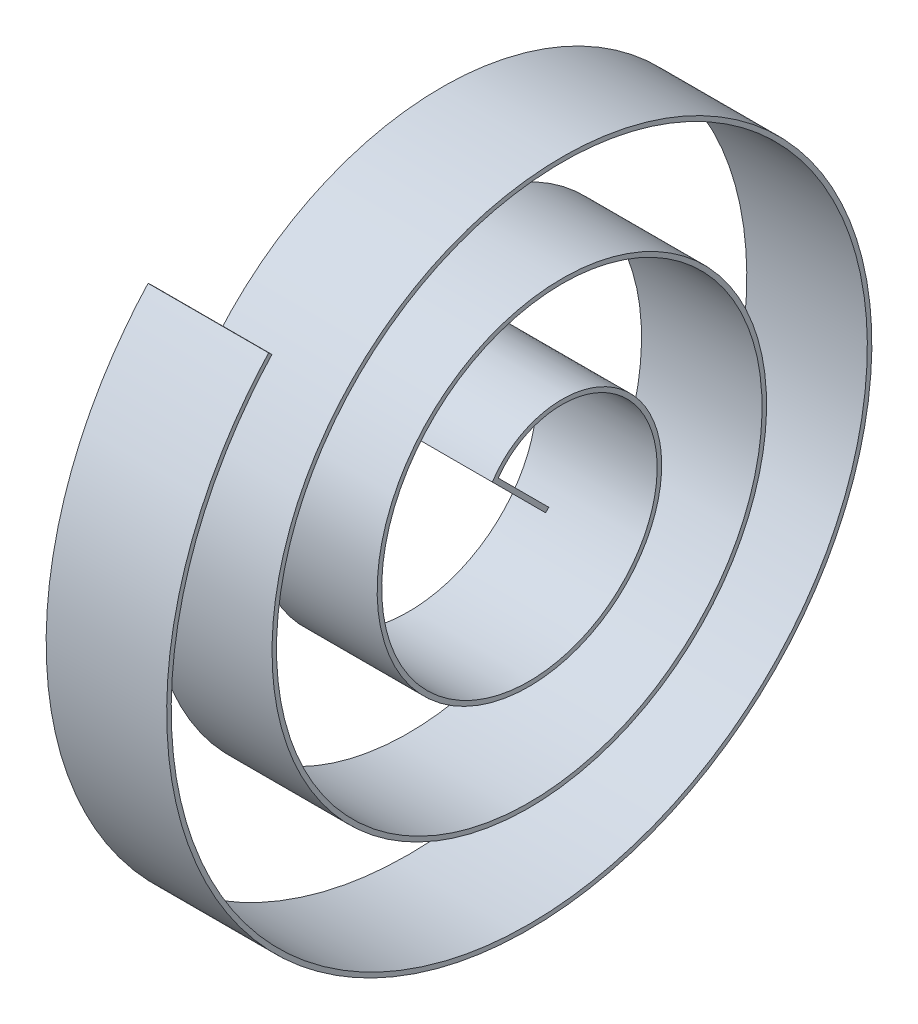
ISO-10303-21;
HEADER;
FILE_DESCRIPTION(('STEP AP214'),'2;1');
FILE_NAME('part.step','',(''),(''),'','','');
FILE_SCHEMA(('AUTOMOTIVE_DESIGN { 1 0 10303 214 1 1 1 1 }'));
ENDSEC;
DATA;
#1=APPLICATION_CONTEXT('core data for automotive mechanical design processes');
#2=APPLICATION_PROTOCOL_DEFINITION('international standard','automotive_design',2000,#1);
#3=PRODUCT_CONTEXT('',#1,'mechanical');
#4=PRODUCT('Part','Part','',(#3));
#5=PRODUCT_RELATED_PRODUCT_CATEGORY('part','',(#4));
#6=PRODUCT_DEFINITION_FORMATION('','',#4);
#7=PRODUCT_DEFINITION_CONTEXT('part definition',#1,'design');
#8=PRODUCT_DEFINITION('design','',#6,#7);
#9=PRODUCT_DEFINITION_SHAPE('','',#8);
#10=(LENGTH_UNIT() NAMED_UNIT(*) SI_UNIT(.MILLI.,.METRE.));
#11=(NAMED_UNIT(*) PLANE_ANGLE_UNIT() SI_UNIT($,.RADIAN.));
#12=(NAMED_UNIT(*) SI_UNIT($,.STERADIAN.) SOLID_ANGLE_UNIT());
#13=UNCERTAINTY_MEASURE_WITH_UNIT(LENGTH_MEASURE(1.E-05),#10,'distance_accuracy_value','');
#14=(GEOMETRIC_REPRESENTATION_CONTEXT(3) GLOBAL_UNCERTAINTY_ASSIGNED_CONTEXT((#13)) GLOBAL_UNIT_ASSIGNED_CONTEXT((#10,
#11,#12)) REPRESENTATION_CONTEXT('',''));
#15=CARTESIAN_POINT('',(0.,0.,0.));
#16=DIRECTION('',(0.,0.,1.));
#17=DIRECTION('',(1.,0.,0.));
#18=AXIS2_PLACEMENT_3D('',#15,#16,#17);
#19=CARTESIAN_POINT('',(8.,3.57307502586645,3.14881095715455));
#20=CARTESIAN_POINT('',(8.,3.96109230752641,2.8728539798839));
#21=CARTESIAN_POINT('',(8.,4.3195926374702,2.52778417418626));
#22=CARTESIAN_POINT('',(8.,4.93080282278117,1.71712251934));
#23=CARTESIAN_POINT('',(8.,5.18386718508715,1.25209204868681));
#24=CARTESIAN_POINT('',(8.,5.54437982955123,0.235795563961639));
#25=CARTESIAN_POINT('',(8.,5.65236540281003,-0.315040978135409));
#26=CARTESIAN_POINT('',(8.,5.69450907537752,-1.45578745427931));
#27=CARTESIAN_POINT('',(8.,5.62933758302838,-2.04545735581655));
#28=CARTESIAN_POINT('',(8.,5.31261555750212,-3.20786652030925));
#29=CARTESIAN_POINT('',(8.,5.06180146520721,-3.78059417427858));
#30=CARTESIAN_POINT('',(8.,4.37953657598555,-4.84953525350304));
#31=CARTESIAN_POINT('',(8.,3.94881055526763,-5.34598089537753));
#32=CARTESIAN_POINT('',(8.,2.93162205528361,-6.20519420242983));
#33=CARTESIAN_POINT('',(8.,2.34579255191745,-6.56842714045899));
#34=CARTESIAN_POINT('',(8.,1.06135967564293,-7.11261637570113));
#35=CARTESIAN_POINT('',(8.,0.363223589407292,-7.29423425550661));
#36=CARTESIAN_POINT('',(8.,-1.08784702964843,-7.44081708658565));
#37=CARTESIAN_POINT('',(8.,-1.84053934057215,-7.40658023079299));
#38=CARTESIAN_POINT('',(8.,-3.33252977559051,-7.10585614813336));
#39=CARTESIAN_POINT('',(8.,-4.07184865941499,-6.84022666858498));
#40=CARTESIAN_POINT('',(8.,-5.46482735436068,-6.08282589100193));
#41=CARTESIAN_POINT('',(8.,-6.11878252012311,-5.5918851116974));
#42=CARTESIAN_POINT('',(8.,-7.27163800262229,-4.4125870874941));
#43=CARTESIAN_POINT('',(8.,-7.77109140444647,-3.72494551803897));
#44=CARTESIAN_POINT('',(8.,-8.55549502981247,-2.20228177936015));
#45=CARTESIAN_POINT('',(8.,-8.84121152013121,-1.36778123877941));
#46=CARTESIAN_POINT('',(8.,-9.15515187958463,0.380764222283271));
#47=CARTESIAN_POINT('',(8.,-9.18428671262537,1.29454373663526));
#48=CARTESIAN_POINT('',(8.,-8.96379808324886,3.1214901115603));
#49=CARTESIAN_POINT('',(8.,-8.71514423870526,4.03468587348595));
#50=CARTESIAN_POINT('',(8.,-7.94296789841683,5.77499449597139));
#51=CARTESIAN_POINT('',(8.,-7.42037846763175,6.60243983222452));
#52=CARTESIAN_POINT('',(8.,-6.13054214211044,8.08838707092323));
#53=CARTESIAN_POINT('',(8.,-5.36409696511568,8.74750363158442));
#54=CARTESIAN_POINT('',(8.,-3.64175439522044,9.82465019712268));
#55=CARTESIAN_POINT('',(8.,-2.68644277152383,10.2435262968416));
#56=CARTESIAN_POINT('',(8.,-0.662751223044029,10.7862773421137));
#57=CARTESIAN_POINT('',(8.,0.405324322853519,10.9111541020581));
#58=CARTESIAN_POINT('',(8.,2.56303573082061,10.8363771799356));
#59=CARTESIAN_POINT('',(8.,3.65268768622527,10.6377874139845));
#60=CARTESIAN_POINT('',(8.,5.7547366609891,9.91507650483496));
#61=CARTESIAN_POINT('',(8.,6.76747831948712,9.39197893960282));
#62=CARTESIAN_POINT('',(8.,8.61849521649582,8.0494158625148));
#63=CARTESIAN_POINT('',(8.,9.4574191424861,7.23083251397343));
#64=CARTESIAN_POINT('',(8.,10.8743962782716,5.35548162036341));
#65=CARTESIAN_POINT('',(8.,11.4533469001882,4.29936536975354));
#66=CARTESIAN_POINT('',(8.,12.2834124075107,2.03221063257928));
#67=CARTESIAN_POINT('',(8.,12.5355922135296,0.821524013085526));
#68=CARTESIAN_POINT('',(8.,12.6718059829777,-1.65292296112946));
#69=CARTESIAN_POINT('',(8.,12.5569729375407,-2.91667122590764));
#70=CARTESIAN_POINT('',(8.,11.9505599466212,-5.385346331739));
#71=CARTESIAN_POINT('',(8.,11.4600730666154,-6.59060843530373));
#72=CARTESIAN_POINT('',(8.,10.1277827533959,-8.83024156834995));
#73=CARTESIAN_POINT('',(8.,9.28692659962339,-9.86526871032419));
#74=CARTESIAN_POINT('',(8.,7.31261519929282,-11.6625217345717));
#75=CARTESIAN_POINT('',(8.,6.17986836164054,-12.4256661422301));
#76=CARTESIAN_POINT('',(8.,3.70991010691031,-13.5972503741532));
#77=CARTESIAN_POINT('',(8.,2.37309741088604,-14.0067861845105));
#78=CARTESIAN_POINT('',(8.,-0.394204612094993,-14.4176780641174));
#79=CARTESIAN_POINT('',(8.,-1.82464610486125,-14.4202042964493));
#80=CARTESIAN_POINT('',(8.,-4.65490935375498,-13.9981832457778));
#81=CARTESIAN_POINT('',(8.,-6.05504131544586,-13.5747688293481));
#82=CARTESIAN_POINT('',(8.,-8.69765314967013,-12.3197772466251));
#83=CARTESIAN_POINT('',(8.,-9.94077336004313,-11.4891870675665));
#84=CARTESIAN_POINT('',(8.,-12.1510594901058,-9.47643867922713));
#85=CARTESIAN_POINT('',(8.,-13.1191354536118,-8.29502677512615));
#86=CARTESIAN_POINT('',(8.,-14.6808883650048,-5.67133112940017));
#87=CARTESIAN_POINT('',(8.,-15.2756579896003,-4.22948156332216));
#88=CARTESIAN_POINT('',(8.,-16.0219609602059,-1.2028623870333));
#89=CARTESIAN_POINT('',(8.,-16.174664524374,0.381826008769462));
#90=CARTESIAN_POINT('',(8.,-16.0050299663617,3.55851727444573));
#91=CARTESIAN_POINT('',(8.,-15.6838270115117,5.15079792938849));
#92=CARTESIAN_POINT('',(8.,-14.5759376241843,8.20099247823797));
#93=CARTESIAN_POINT('',(8.,-13.7902425484004,9.65951376491688));
#94=CARTESIAN_POINT('',(8.,-11.8050209959112,12.3069983198951));
#95=CARTESIAN_POINT('',(8.,-10.6062481177272,13.496836761133));
#96=CARTESIAN_POINT('',(8.,-7.88555034012637,15.4906941281649));
#97=CARTESIAN_POINT('',(8.,-6.36407162858304,16.2957680813785));
#98=CARTESIAN_POINT('',(8.,-3.12095185822164,17.433939198042));
#99=CARTESIAN_POINT('',(8.,-1.39941120792109,17.768166259));
#100=CARTESIAN_POINT('',(8.,2.09841444727701,17.9174381114325));
#101=CARTESIAN_POINT('',(8.,3.87494815698145,17.7335764373095));
#102=CARTESIAN_POINT('',(8.,7.32716987322796,16.8440540313642));
#103=CARTESIAN_POINT('',(8.,9.00342389248835,16.1393444429706));
#104=CARTESIAN_POINT('',(8.,12.1029217003954,14.2519048451646));
#105=CARTESIAN_POINT('',(8.,13.5269854328049,13.0698936599758));
#106=CARTESIAN_POINT('',(8.,15.9871144730682,10.3157110915735));
#107=CARTESIAN_POINT('',(8.,17.0241655844139,8.74396156450273));
#108=CARTESIAN_POINT('',(8.,18.6051220015607,5.33588488708603));
#109=CARTESIAN_POINT('',(8.,19.1500756716958,3.49964973859242));
#110=CARTESIAN_POINT('',(8.,19.6819293478894,-0.284053024765198));
#111=CARTESIAN_POINT('',(8.,19.6698328069933,-2.23175653044206));
#112=CARTESIAN_POINT('',(8.,19.070040463635,-6.07006358569258));
#113=CARTESIAN_POINT('',(8.,18.4832030176167,-7.96119476508436));
#114=CARTESIAN_POINT('',(8.,16.7668481269284,-11.5175646442059));
#115=CARTESIAN_POINT('',(8.,15.6379616732078,-13.1835567061493));
#116=CARTESIAN_POINT('',(8.,12.9195724588861,-16.135420839484));
#117=CARTESIAN_POINT('',(8.,11.3304176124854,-17.4221837108694));
#118=CARTESIAN_POINT('',(8.,7.81694092430151,-19.4901141762452));
#119=CARTESIAN_POINT('',(8.,5.89266046612715,-20.2722094029083));
#120=CARTESIAN_POINT('',(8.,1.86795481855597,-21.2461316557413));
#121=CARTESIAN_POINT('',(8.,-0.232724597418462,-21.4388215357373));
#122=CARTESIAN_POINT('',(8.,-4.43073870734949,-21.1988316161889));
#123=CARTESIAN_POINT('',(8.,-6.52857966449705,-20.7668586597557));
#124=CARTESIAN_POINT('',(8.,-10.5362804156211,-19.2966198394509));
#125=CARTESIAN_POINT('',(8.,-12.4468276757331,-18.2588341545157));
#126=CARTESIAN_POINT('',(8.,-15.9063843356934,-15.6501376389941));
#127=CARTESIAN_POINT('',(8.,-17.4561727998498,-14.079438104508));
#128=CARTESIAN_POINT('',(8.,-20.0474427038859,-10.5272662514733));
#129=CARTESIAN_POINT('',(8.,-21.0896970848636,-8.54572716526006));
#130=CARTESIAN_POINT('',(8.,-22.5596881706203,-4.3339913982284));
#131=CARTESIAN_POINT('',(8.,-22.9880974863866,-2.10347453094448));
#132=CARTESIAN_POINT('',(8.,-23.1752978895581,2.41755942204449));
#133=CARTESIAN_POINT('',(8.,-22.9345818522504,4.70859481036539));
#134=CARTESIAN_POINT('',(8.,-21.7858447091127,9.15141010455465));
#135=CARTESIAN_POINT('',(8.,-20.8780817725514,11.3038272897842));
#136=CARTESIAN_POINT('',(8.,-18.4563575678637,15.2768717422315));
#137=CARTESIAN_POINT('',(8.,-16.9423960593364,17.0981620371013));
#138=CARTESIAN_POINT('',(8.,-13.4243777184362,20.2403294062057));
#139=CARTESIAN_POINT('',(8.,-11.4200729702312,21.5617995353227));
#140=CARTESIAN_POINT('',(8.,-7.08369517269846,23.5751419983877));
#141=CARTESIAN_POINT('',(8.,-4.75117075448713,24.2674513271159));
#142=CARTESIAN_POINT('',(8.,0.0461914649522487,24.9451684693432));
#143=CARTESIAN_POINT('',(8.,2.5116114483648,24.93079200187));
#144=CARTESIAN_POINT('',(8.,7.36254920605341,24.1778874159749));
#145=CARTESIAN_POINT('',(8.,9.74868763494423,23.4393183857427));
#146=CARTESIAN_POINT('',(8.,14.2303541850832,21.2839023563238));
#147=CARTESIAN_POINT('',(8.,16.3264345722945,19.8667636648047));
#148=CARTESIAN_POINT('',(8.,18.1819201523586,18.1637573547356));
#149=B_SPLINE_CURVE_WITH_KNOTS('',3,(#19,#20,#21,#22,#23,#24,#25,#26,#27,#28,#29,#30,#31,#32,
#33,#34,#35,#36,#37,#38,#39,#40,#41,#42,#43,#44,#45,#46,#47,#48,#49,#50,#51,#52,#53,#54,#55,#56,
#57,#58,#59,#60,#61,#62,#63,#64,#65,#66,#67,#68,#69,#70,#71,#72,#73,#74,#75,#76,#77,#78,#79,#80,
#81,#82,#83,#84,#85,#86,#87,#88,#89,#90,#91,#92,#93,#94,#95,#96,#97,#98,#99,#100,#101,#102,#103,
#104,#105,#106,#107,#108,#109,#110,#111,#112,#113,#114,#115,#116,#117,#118,#119,#120,#121,#122,
#123,#124,#125,#126,#127,#128,#129,#130,#131,#132,#133,#134,#135,#136,#137,#138,#139,#140,#141,
#142,#143,#144,#145,#146,#147,#148),.UNSPECIFIED.,.F.,.F.,(4,2,2,2,2,2,2,2,2,2,2,2,2,2,2,2,2,2,
2,2,2,2,2,2,2,2,2,2,2,2,2,2,2,2,2,2,2,2,2,2,2,2,2,2,2,2,2,2,2,2,2,2,2,2,2,2,2,2,2,2,2,2,2,2,4),
(0.,0.015625,0.03125,0.046875,0.0625,0.078125,0.09375,0.109375,0.125,0.140625,0.15625,0.171875,
0.1875,0.203125,0.21875,0.234375,0.25,0.265625,0.28125,0.296875,0.3125,0.328125,0.34375,
0.359375,0.375,0.390625,0.40625,0.421875,0.4375,0.453125,0.46875,0.484375,0.5,0.515625,0.53125,
0.546875,0.5625,0.578125,0.59375,0.609375,0.625,0.640625,0.65625,0.671875,0.6875,0.703125,
0.71875,0.734375,0.75,0.765625,0.78125,0.796875,0.8125,0.828125,0.84375,0.859375,0.875,0.890625,
0.90625,0.921875,0.9375,0.953125,0.96875,0.984375,1.),.UNSPECIFIED.);
#150=DIRECTION('',(-1.,0.,0.));
#151=VECTOR('',#150,1.);
#152=SURFACE_OF_LINEAR_EXTRUSION('',#149,#151);
#153=CARTESIAN_POINT('',(0.,3.57307502586645,3.14881095715455));
#154=CARTESIAN_POINT('',(0.,3.96109230752641,2.8728539798839));
#155=CARTESIAN_POINT('',(0.,4.3195926374702,2.52778417418626));
#156=CARTESIAN_POINT('',(0.,4.93080282278117,1.71712251934));
#157=CARTESIAN_POINT('',(0.,5.18386718508715,1.25209204868681));
#158=CARTESIAN_POINT('',(0.,5.54437982955123,0.235795563961639));
#159=CARTESIAN_POINT('',(0.,5.65236540281003,-0.315040978135409));
#160=CARTESIAN_POINT('',(0.,5.69450907537752,-1.45578745427931));
#161=CARTESIAN_POINT('',(0.,5.62933758302838,-2.04545735581655));
#162=CARTESIAN_POINT('',(0.,5.31261555750212,-3.20786652030925));
#163=CARTESIAN_POINT('',(0.,5.06180146520721,-3.78059417427858));
#164=CARTESIAN_POINT('',(0.,4.37953657598555,-4.84953525350304));
#165=CARTESIAN_POINT('',(0.,3.94881055526763,-5.34598089537753));
#166=CARTESIAN_POINT('',(0.,2.93162205528361,-6.20519420242983));
#167=CARTESIAN_POINT('',(0.,2.34579255191745,-6.56842714045899));
#168=CARTESIAN_POINT('',(0.,1.06135967564293,-7.11261637570113));
#169=CARTESIAN_POINT('',(0.,0.363223589407292,-7.29423425550661));
#170=CARTESIAN_POINT('',(0.,-1.08784702964843,-7.44081708658565));
#171=CARTESIAN_POINT('',(0.,-1.84053934057215,-7.40658023079299));
#172=CARTESIAN_POINT('',(0.,-3.33252977559051,-7.10585614813336));
#173=CARTESIAN_POINT('',(0.,-4.07184865941499,-6.84022666858498));
#174=CARTESIAN_POINT('',(0.,-5.46482735436068,-6.08282589100193));
#175=CARTESIAN_POINT('',(0.,-6.11878252012311,-5.5918851116974));
#176=CARTESIAN_POINT('',(0.,-7.27163800262229,-4.4125870874941));
#177=CARTESIAN_POINT('',(0.,-7.77109140444647,-3.72494551803897));
#178=CARTESIAN_POINT('',(0.,-8.55549502981247,-2.20228177936015));
#179=CARTESIAN_POINT('',(0.,-8.84121152013121,-1.36778123877941));
#180=CARTESIAN_POINT('',(0.,-9.15515187958463,0.380764222283271));
#181=CARTESIAN_POINT('',(0.,-9.18428671262537,1.29454373663526));
#182=CARTESIAN_POINT('',(0.,-8.96379808324886,3.1214901115603));
#183=CARTESIAN_POINT('',(0.,-8.71514423870526,4.03468587348595));
#184=CARTESIAN_POINT('',(0.,-7.94296789841683,5.77499449597139));
#185=CARTESIAN_POINT('',(0.,-7.42037846763175,6.60243983222452));
#186=CARTESIAN_POINT('',(0.,-6.13054214211044,8.08838707092323));
#187=CARTESIAN_POINT('',(0.,-5.36409696511568,8.74750363158442));
#188=CARTESIAN_POINT('',(0.,-3.64175439522044,9.82465019712268));
#189=CARTESIAN_POINT('',(0.,-2.68644277152383,10.2435262968416));
#190=CARTESIAN_POINT('',(0.,-0.662751223044029,10.7862773421137));
#191=CARTESIAN_POINT('',(0.,0.405324322853519,10.9111541020581));
#192=CARTESIAN_POINT('',(0.,2.56303573082061,10.8363771799356));
#193=CARTESIAN_POINT('',(0.,3.65268768622527,10.6377874139845));
#194=CARTESIAN_POINT('',(0.,5.7547366609891,9.91507650483496));
#195=CARTESIAN_POINT('',(0.,6.76747831948712,9.39197893960282));
#196=CARTESIAN_POINT('',(0.,8.61849521649582,8.0494158625148));
#197=CARTESIAN_POINT('',(0.,9.4574191424861,7.23083251397343));
#198=CARTESIAN_POINT('',(0.,10.8743962782716,5.35548162036341));
#199=CARTESIAN_POINT('',(0.,11.4533469001882,4.29936536975354));
#200=CARTESIAN_POINT('',(0.,12.2834124075107,2.03221063257928));
#201=CARTESIAN_POINT('',(0.,12.5355922135296,0.821524013085526));
#202=CARTESIAN_POINT('',(0.,12.6718059829777,-1.65292296112946));
#203=CARTESIAN_POINT('',(0.,12.5569729375407,-2.91667122590764));
#204=CARTESIAN_POINT('',(0.,11.9505599466212,-5.385346331739));
#205=CARTESIAN_POINT('',(0.,11.4600730666154,-6.59060843530373));
#206=CARTESIAN_POINT('',(0.,10.1277827533959,-8.83024156834995));
#207=CARTESIAN_POINT('',(0.,9.28692659962339,-9.86526871032419));
#208=CARTESIAN_POINT('',(0.,7.31261519929282,-11.6625217345717));
#209=CARTESIAN_POINT('',(0.,6.17986836164054,-12.4256661422301));
#210=CARTESIAN_POINT('',(0.,3.70991010691031,-13.5972503741532));
#211=CARTESIAN_POINT('',(0.,2.37309741088604,-14.0067861845105));
#212=CARTESIAN_POINT('',(0.,-0.394204612094993,-14.4176780641174));
#213=CARTESIAN_POINT('',(0.,-1.82464610486125,-14.4202042964493));
#214=CARTESIAN_POINT('',(0.,-4.65490935375498,-13.9981832457778));
#215=CARTESIAN_POINT('',(0.,-6.05504131544586,-13.5747688293481));
#216=CARTESIAN_POINT('',(0.,-8.69765314967013,-12.3197772466251));
#217=CARTESIAN_POINT('',(0.,-9.94077336004313,-11.4891870675665));
#218=CARTESIAN_POINT('',(0.,-12.1510594901058,-9.47643867922713));
#219=CARTESIAN_POINT('',(0.,-13.1191354536118,-8.29502677512615));
#220=CARTESIAN_POINT('',(0.,-14.6808883650048,-5.67133112940017));
#221=CARTESIAN_POINT('',(0.,-15.2756579896003,-4.22948156332216));
#222=CARTESIAN_POINT('',(0.,-16.0219609602059,-1.2028623870333));
#223=CARTESIAN_POINT('',(0.,-16.174664524374,0.381826008769462));
#224=CARTESIAN_POINT('',(0.,-16.0050299663617,3.55851727444573));
#225=CARTESIAN_POINT('',(0.,-15.6838270115117,5.15079792938849));
#226=CARTESIAN_POINT('',(0.,-14.5759376241843,8.20099247823797));
#227=CARTESIAN_POINT('',(0.,-13.7902425484004,9.65951376491688));
#228=CARTESIAN_POINT('',(0.,-11.8050209959112,12.3069983198951));
#229=CARTESIAN_POINT('',(0.,-10.6062481177272,13.496836761133));
#230=CARTESIAN_POINT('',(0.,-7.88555034012637,15.4906941281649));
#231=CARTESIAN_POINT('',(0.,-6.36407162858304,16.2957680813785));
#232=CARTESIAN_POINT('',(0.,-3.12095185822164,17.433939198042));
#233=CARTESIAN_POINT('',(0.,-1.39941120792109,17.768166259));
#234=CARTESIAN_POINT('',(0.,2.09841444727701,17.9174381114325));
#235=CARTESIAN_POINT('',(0.,3.87494815698145,17.7335764373095));
#236=CARTESIAN_POINT('',(0.,7.32716987322796,16.8440540313642));
#237=CARTESIAN_POINT('',(0.,9.00342389248835,16.1393444429706));
#238=CARTESIAN_POINT('',(0.,12.1029217003954,14.2519048451646));
#239=CARTESIAN_POINT('',(0.,13.5269854328049,13.0698936599758));
#240=CARTESIAN_POINT('',(0.,15.9871144730682,10.3157110915735));
#241=CARTESIAN_POINT('',(0.,17.0241655844139,8.74396156450273));
#242=CARTESIAN_POINT('',(0.,18.6051220015607,5.33588488708603));
#243=CARTESIAN_POINT('',(0.,19.1500756716958,3.49964973859242));
#244=CARTESIAN_POINT('',(0.,19.6819293478894,-0.284053024765198));
#245=CARTESIAN_POINT('',(0.,19.6698328069933,-2.23175653044206));
#246=CARTESIAN_POINT('',(0.,19.070040463635,-6.07006358569258));
#247=CARTESIAN_POINT('',(0.,18.4832030176167,-7.96119476508436));
#248=CARTESIAN_POINT('',(0.,16.7668481269284,-11.5175646442059));
#249=CARTESIAN_POINT('',(0.,15.6379616732078,-13.1835567061493));
#250=CARTESIAN_POINT('',(0.,12.9195724588861,-16.135420839484));
#251=CARTESIAN_POINT('',(0.,11.3304176124854,-17.4221837108694));
#252=CARTESIAN_POINT('',(0.,7.81694092430151,-19.4901141762452));
#253=CARTESIAN_POINT('',(0.,5.89266046612715,-20.2722094029083));
#254=CARTESIAN_POINT('',(0.,1.86795481855597,-21.2461316557413));
#255=CARTESIAN_POINT('',(0.,-0.232724597418462,-21.4388215357373));
#256=CARTESIAN_POINT('',(0.,-4.43073870734949,-21.1988316161889));
#257=CARTESIAN_POINT('',(0.,-6.52857966449705,-20.7668586597557));
#258=CARTESIAN_POINT('',(0.,-10.5362804156211,-19.2966198394509));
#259=CARTESIAN_POINT('',(0.,-12.4468276757331,-18.2588341545157));
#260=CARTESIAN_POINT('',(0.,-15.9063843356934,-15.6501376389941));
#261=CARTESIAN_POINT('',(0.,-17.4561727998498,-14.079438104508));
#262=CARTESIAN_POINT('',(0.,-20.0474427038859,-10.5272662514733));
#263=CARTESIAN_POINT('',(0.,-21.0896970848636,-8.54572716526006));
#264=CARTESIAN_POINT('',(0.,-22.5596881706203,-4.3339913982284));
#265=CARTESIAN_POINT('',(0.,-22.9880974863866,-2.10347453094448));
#266=CARTESIAN_POINT('',(0.,-23.1752978895581,2.41755942204449));
#267=CARTESIAN_POINT('',(0.,-22.9345818522504,4.70859481036539));
#268=CARTESIAN_POINT('',(0.,-21.7858447091127,9.15141010455465));
#269=CARTESIAN_POINT('',(0.,-20.8780817725514,11.3038272897842));
#270=CARTESIAN_POINT('',(0.,-18.4563575678637,15.2768717422315));
#271=CARTESIAN_POINT('',(0.,-16.9423960593364,17.0981620371013));
#272=CARTESIAN_POINT('',(0.,-13.4243777184362,20.2403294062057));
#273=CARTESIAN_POINT('',(0.,-11.4200729702312,21.5617995353227));
#274=CARTESIAN_POINT('',(0.,-7.08369517269846,23.5751419983877));
#275=CARTESIAN_POINT('',(0.,-4.75117075448713,24.2674513271159));
#276=CARTESIAN_POINT('',(0.,0.0461914649522487,24.9451684693432));
#277=CARTESIAN_POINT('',(0.,2.5116114483648,24.93079200187));
#278=CARTESIAN_POINT('',(0.,7.36254920605341,24.1778874159749));
#279=CARTESIAN_POINT('',(0.,9.74868763494423,23.4393183857427));
#280=CARTESIAN_POINT('',(0.,14.2303541850832,21.2839023563238));
#281=CARTESIAN_POINT('',(0.,16.3264345722945,19.8667636648047));
#282=CARTESIAN_POINT('',(0.,18.1819201523586,18.1637573547356));
#283=B_SPLINE_CURVE_WITH_KNOTS('',3,(#153,#154,#155,#156,#157,#158,#159,#160,#161,#162,#163,
#164,#165,#166,#167,#168,#169,#170,#171,#172,#173,#174,#175,#176,#177,#178,#179,#180,#181,#182,
#183,#184,#185,#186,#187,#188,#189,#190,#191,#192,#193,#194,#195,#196,#197,#198,#199,#200,#201,
#202,#203,#204,#205,#206,#207,#208,#209,#210,#211,#212,#213,#214,#215,#216,#217,#218,#219,#220,
#221,#222,#223,#224,#225,#226,#227,#228,#229,#230,#231,#232,#233,#234,#235,#236,#237,#238,#239,
#240,#241,#242,#243,#244,#245,#246,#247,#248,#249,#250,#251,#252,#253,#254,#255,#256,#257,#258,
#259,#260,#261,#262,#263,#264,#265,#266,#267,#268,#269,#270,#271,#272,#273,#274,#275,#276,#277,
#278,#279,#280,#281,#282),.UNSPECIFIED.,.F.,.F.,(4,2,2,2,2,2,2,2,2,2,2,2,2,2,2,2,2,2,2,2,2,2,2,
2,2,2,2,2,2,2,2,2,2,2,2,2,2,2,2,2,2,2,2,2,2,2,2,2,2,2,2,2,2,2,2,2,2,2,2,2,2,2,2,2,4),(0.,
0.015625,0.03125,0.046875,0.0625,0.078125,0.09375,0.109375,0.125,0.140625,0.15625,0.171875,
0.1875,0.203125,0.21875,0.234375,0.25,0.265625,0.28125,0.296875,0.3125,0.328125,0.34375,
0.359375,0.375,0.390625,0.40625,0.421875,0.4375,0.453125,0.46875,0.484375,0.5,0.515625,0.53125,
0.546875,0.5625,0.578125,0.59375,0.609375,0.625,0.640625,0.65625,0.671875,0.6875,0.703125,
0.71875,0.734375,0.75,0.765625,0.78125,0.796875,0.8125,0.828125,0.84375,0.859375,0.875,0.890625,
0.90625,0.921875,0.9375,0.953125,0.96875,0.984375,1.),.UNSPECIFIED.);
#284=CARTESIAN_POINT('',(0.,3.57307502586645,3.14881095715455));
#285=VERTEX_POINT('',#284);
#286=CARTESIAN_POINT('',(0.,18.1819201523586,18.1637573547356));
#287=VERTEX_POINT('',#286);
#288=EDGE_CURVE('E119',#285,#287,#283,.T.);
#289=ORIENTED_EDGE('',*,*,#288,.T.);
#290=DIRECTION('',(-1.,0.,0.));
#291=VECTOR('',#290,1.);
#292=CARTESIAN_POINT('',(8.,18.1819201523586,18.1637573547356));
#293=LINE('',#292,#291);
#294=CARTESIAN_POINT('',(8.,18.1819201523586,18.1637573547356));
#295=VERTEX_POINT('',#294);
#296=EDGE_CURVE('E11',#295,#287,#293,.T.);
#297=ORIENTED_EDGE('',*,*,#296,.F.);
#298=CARTESIAN_POINT('',(8.,3.57307502586645,3.14881095715455));
#299=VERTEX_POINT('',#298);
#300=EDGE_CURVE('E84',#299,#295,#149,.T.);
#301=ORIENTED_EDGE('',*,*,#300,.F.);
#302=DIRECTION('',(-1.,0.,0.));
#303=VECTOR('',#302,1.);
#304=CARTESIAN_POINT('',(8.,3.57307502586645,3.14881095715455));
#305=LINE('',#304,#303);
#306=EDGE_CURVE('E115',#299,#285,#305,.T.);
#307=ORIENTED_EDGE('',*,*,#306,.T.);
#308=EDGE_LOOP('',(#289,#297,#301,#307));
#309=FACE_BOUND('',#308,.T.);
#310=ADVANCED_FACE('F37',(#309),#152,.F.);
#311=CARTESIAN_POINT('',(8.,18.3847763108501,18.3847763108503));
#312=DIRECTION('',(0.,0.736729853715793,-0.676187194971856));
#313=DIRECTION('',(0.,0.676187194971856,0.736729853715793));
#314=AXIS2_PLACEMENT_3D('',#311,#312,#313);
#315=PLANE('',#314);
#316=DIRECTION('',(0.,-0.676187194971856,-0.736729853715793));
#317=VECTOR('',#316,1.);
#318=CARTESIAN_POINT('',(0.,18.3847763108501,18.3847763108503));
#319=LINE('',#318,#317);
#320=CARTESIAN_POINT('',(0.,18.3847763108501,18.3847763108503));
#321=VERTEX_POINT('',#320);
#322=EDGE_CURVE('E124',#321,#287,#319,.T.);
#323=ORIENTED_EDGE('',*,*,#322,.F.);
#324=DIRECTION('',(-1.,0.,0.));
#325=VECTOR('',#324,1.);
#326=CARTESIAN_POINT('',(8.,18.3847763108501,18.3847763108503));
#327=LINE('',#326,#325);
#328=CARTESIAN_POINT('',(8.,18.3847763108501,18.3847763108503));
#329=VERTEX_POINT('',#328);
#330=EDGE_CURVE('E46',#329,#321,#327,.T.);
#331=ORIENTED_EDGE('',*,*,#330,.F.);
#332=DIRECTION('',(0.,-0.676187194971856,-0.736729853715793));
#333=VECTOR('',#332,1.);
#334=CARTESIAN_POINT('',(8.,18.3847763108501,18.3847763108503));
#335=LINE('',#334,#333);
#336=EDGE_CURVE('E178',#329,#295,#335,.T.);
#337=ORIENTED_EDGE('',*,*,#336,.T.);
#338=ORIENTED_EDGE('',*,*,#296,.T.);
#339=EDGE_LOOP('',(#323,#331,#337,#338));
#340=FACE_BOUND('',#339,.T.);
#341=ADVANCED_FACE('F150',(#340),#315,.T.);
#342=CARTESIAN_POINT('',(8.,3.53553390593272,3.53553390593276));
#343=CARTESIAN_POINT('',(8.,3.95997393966862,3.26577348058142));
#344=CARTESIAN_POINT('',(8.,4.35594488194076,2.92142366440562));
#345=CARTESIAN_POINT('',(8.,5.04202859127138,2.10189781239647));
#346=CARTESIAN_POINT('',(8.,5.33195949250985,1.62677272127225));
#347=CARTESIAN_POINT('',(8.,5.76317399205168,0.580186546535259));
#348=CARTESIAN_POINT('',(8.,5.90429677428624,0.00883489873990098));
#349=CARTESIAN_POINT('',(8.,6.00682042307163,-1.18197754705927));
#350=CARTESIAN_POINT('',(8.,5.96809995447752,-1.80127893129966));
#351=CARTESIAN_POINT('',(8.,5.69587914347751,-3.03009940230954));
#352=CARTESIAN_POINT('',(8.,5.46231204522045,-3.63942328386917));
#353=CARTESIAN_POINT('',(8.,4.80423303850345,-4.78611252142919));
#354=CARTESIAN_POINT('',(8.,4.3797190184172,-5.3232654794449));
#355=CARTESIAN_POINT('',(8.,3.36354110429356,-6.26534224202179));
#356=CARTESIAN_POINT('',(8.,2.77194353587403,-6.67005771100383));
#357=CARTESIAN_POINT('',(8.,1.46439847280836,-7.29529031358808));
#358=CARTESIAN_POINT('',(8.,0.748582624488233,-7.515625));
#359=CARTESIAN_POINT('',(8.,-0.748582624488152,-7.73437500000001));
#360=CARTESIAN_POINT('',(8.,-1.52974503932013,-7.73265393742382));
#361=CARTESIAN_POINT('',(8.,-3.08759560825858,-7.48867827781665));
#362=CARTESIAN_POINT('',(8.,-3.86405754013613,-7.24634979183469));
#363=CARTESIAN_POINT('',(8.,-5.33757444425096,-6.52486566192627));
#364=CARTESIAN_POINT('',(8.,-6.03438479604447,-6.04570944993658));
#365=CARTESIAN_POINT('',(8.,-7.2758889477951,-4.87774991175627));
#366=CARTESIAN_POINT('',(8.,-7.8203433910236,-4.18902327157454));
#367=CARTESIAN_POINT('',(8.,-8.69400325261562,-2.65144308195153));
#368=CARTESIAN_POINT('',(8.,-9.02299880237392,-1.80273983205223));
#369=CARTESIAN_POINT('',(8.,-9.41901816377023,-0.0136402996800443));
#370=CARTESIAN_POINT('',(8.,-9.48588398463175,0.926543225683401));
#371=CARTESIAN_POINT('',(8.,-9.33293358310526,2.81675232800096));
#372=CARTESIAN_POINT('',(8.,-9.1130295028978,3.7665205548843));
#373=CARTESIAN_POINT('',(8.,-8.38759558651492,5.5877584415065));
#374=CARTESIAN_POINT('',(8.,-7.8820601735343,6.45894923240537));
#375=CARTESIAN_POINT('',(8.,-6.61362884079001,8.03673978191878));
#376=CARTESIAN_POINT('',(8.,-5.85081422545737,8.74306537108121));
#377=CARTESIAN_POINT('',(8.,-4.12217298801775,9.91508137778861));
#378=CARTESIAN_POINT('',(8.,-3.1565108529893,10.3805292398527));
#379=CARTESIAN_POINT('',(8.,-1.09889679598762,11.0128496889427));
#380=CARTESIAN_POINT('',(8.,-0.00718058038349891,11.1795363431254));
#381=CARTESIAN_POINT('',(8.,2.20950320216319,11.1810204842906));
#382=CARTESIAN_POINT('',(8.,3.33418323094347,11.0157092552801));
#383=CARTESIAN_POINT('',(8.,5.5153711424991,10.3490049340435));
#384=CARTESIAN_POINT('',(8.,6.57156487580577,9.84759435429139));
#385=CARTESIAN_POINT('',(8.,8.51510041321084,8.53556048974128));
#386=CARTESIAN_POINT('',(8.,9.40213029860544,7.72501676786037));
#387=CARTESIAN_POINT('',(8.,10.9169083520379,5.85173080155627));
#388=CARTESIAN_POINT('',(8.,11.5443766579748,4.78916192975577));
#389=CARTESIAN_POINT('',(8.,12.4688448918053,2.49516919009852));
#390=CARTESIAN_POINT('',(8.,12.765625,1.26400016921784));
#391=CARTESIAN_POINT('',(8.,12.984375,-1.2640001692177));
#392=CARTESIAN_POINT('',(8.,12.906208515641,-2.56051575661024));
#393=CARTESIAN_POINT('',(8.,12.3629972247877,-5.10481400214027));
#394=CARTESIAN_POINT('',(8.,11.8979159018509,-6.35224723739878));
#395=CARTESIAN_POINT('',(8.,10.6037304810868,-8.68287219369408));
#396=CARTESIAN_POINT('',(8.,9.77469734171826,-9.76571224728226));
#397=CARTESIAN_POINT('',(8.,7.80989150369292,-11.661171256866));
#398=CARTESIAN_POINT('',(8.,6.67429501176416,-12.4734691815895));
#399=CARTESIAN_POINT('',(8.,4.1843473815954,-13.7416125534182));
#400=CARTESIAN_POINT('',(8.,2.83026548715621,-14.1971988635929));
#401=CARTESIAN_POINT('',(8.,0.0152946180365186,-14.6942577326093));
#402=CARTESIAN_POINT('',(8.,-1.44525347513571,-14.7355596815228));
#403=CARTESIAN_POINT('',(8.,-4.34649045971795,-14.3815033304482));
#404=CARTESIAN_POINT('',(8.,-5.78679573050552,-13.9860822894151));
#405=CARTESIAN_POINT('',(8.,-8.51714900255818,-12.7747160756554));
#406=CARTESIAN_POINT('',(8.,-9.80680459261391,-11.9588260157845));
#407=CARTESIAN_POINT('',(8.,-12.1135056241689,-9.96148420099861));
#408=CARTESIAN_POINT('',(8.,-13.1301858602217,-8.7802047865091));
#409=CARTESIAN_POINT('',(8.,-14.7881341643059,-6.14244816363902));
#410=CARTESIAN_POINT('',(8.,-15.4290989871956,-4.68624898470634));
#411=CARTESIAN_POINT('',(8.,-16.2625253858337,-1.61760704543999));
#412=CARTESIAN_POINT('',(8.,-16.4547759119645,-0.00552626202708139));
#413=CARTESIAN_POINT('',(8.,-16.3552205455095,3.23702885726712));
#414=CARTESIAN_POINT('',(8.,-16.0633185560827,4.86708753058729));
#415=CARTESIAN_POINT('',(8.,-15.0021307246094,8.00064288268867));
#416=CARTESIAN_POINT('',(8.,-14.2328766633623,9.50370646774237));
#417=CARTESIAN_POINT('',(8.,-12.2668879409791,12.2440883049925));
#418=CARTESIAN_POINT('',(8.,-11.0703145173035,13.480995117766));
#419=CARTESIAN_POINT('',(8.,-8.33992049881899,15.5684744620541));
#420=CARTESIAN_POINT('',(8.,-6.80638032363752,16.4186956049458));
#421=CARTESIAN_POINT('',(8.,-3.52593990738869,17.6423994700225));
#422=CARTESIAN_POINT('',(8.,-1.77941771394746,18.015625));
#423=CARTESIAN_POINT('',(8.,1.77941771394723,18.234375));
#424=CARTESIAN_POINT('',(8.,3.59128647390034,18.0797630938583));
#425=CARTESIAN_POINT('',(8.,7.12203239602196,17.2373161717586));
#426=CARTESIAN_POINT('',(8.,8.84043693466144,16.549482011867));
#427=CARTESIAN_POINT('',(8.,12.0281699431372,14.6825953002474));
#428=CARTESIAN_POINT('',(8.,13.49703969852,13.5036852334999));
#429=CARTESIAN_POINT('',(8.,16.0464535659369,10.7420330956296));
#430=CARTESIAN_POINT('',(8.,17.1265949721555,9.15956675195379));
#431=CARTESIAN_POINT('',(8.,18.7892218542207,5.71725168123927));
#432=CARTESIAN_POINT('',(8.,19.3713989248118,3.8577911422602));
#433=CARTESIAN_POINT('',(8.,19.9694973014485,0.016948936392989));
#434=CARTESIAN_POINT('',(8.,19.9852353784138,-1.963963724588));
#435=CARTESIAN_POINT('',(8.,19.4300730777911,-5.87622859143493));
#436=CARTESIAN_POINT('',(8.,18.8591350759323,-7.80707090612674));
#437=CARTESIAN_POINT('',(8.,17.1618365647959,-11.4465395636099));
#438=CARTESIAN_POINT('',(8.,16.0355918580347,-13.1546599528225));
#439=CARTESIAN_POINT('',(8.,13.3093395612072,-16.1902714664191));
#440=CARTESIAN_POINT('',(8.,11.7095953475609,-17.5173063493621));
#441=CARTESIAN_POINT('',(8.,8.16272333926031,-19.6611869508231));
#442=CARTESIAN_POINT('',(8.,6.21598711642339,-20.4776687345385));
#443=CARTESIAN_POINT('',(8.,2.13631729489236,-21.5122010827247));
#444=CARTESIAN_POINT('',(8.,0.00387194367067554,-21.7300154808036));
#445=CARTESIAN_POINT('',(8.,-4.26455451237104,-21.5294206067285));
#446=CARTESIAN_POINT('',(8.,-6.3999918302311,-21.1109278568852));
#447=CARTESIAN_POINT('',(8.,-10.4859146228782,-19.6552565151754));
#448=CARTESIAN_POINT('',(8.,-12.435848059679,-18.6181589724333));
#449=CARTESIAN_POINT('',(8.,-15.9730761967741,-15.9982153922169));
#450=CARTESIAN_POINT('',(8.,-17.5598599369265,-14.4156122667467));
#451=CARTESIAN_POINT('',(8.,-20.2200405720702,-10.8281101960817));
#452=CARTESIAN_POINT('',(8.,-21.2930145519167,-8.82359871751931));
#453=CARTESIAN_POINT('',(8.,-22.8159540482397,-4.5567106246789));
#454=CARTESIAN_POINT('',(8.,-23.265625,-2.29483525867704));
#455=CARTESIAN_POINT('',(8.,-23.484375,2.2948352586768));
#456=CARTESIAN_POINT('',(8.,-23.2533176720755,4.62205719119045));
#457=CARTESIAN_POINT('',(8.,-22.1116351187296,9.13925078990365));
#458=CARTESIAN_POINT('',(8.,-21.2010481218832,11.3286266319241));
#459=CARTESIAN_POINT('',(8.,-18.761460119408,15.3734676925803));
#460=CARTESIAN_POINT('',(8.,-17.2326731252816,17.2283671497579));
#461=CARTESIAN_POINT('',(8.,-13.6741746875662,20.4317358750078));
#462=CARTESIAN_POINT('',(8.,-11.6448384921434,21.7797207627214));
#463=CARTESIAN_POINT('',(8.,-7.25015598088315,23.8368311550233));
#464=CARTESIAN_POINT('',(8.,-4.88531679736419,24.5455989860308));
#465=CARTESIAN_POINT('',(8.,-0.0186032547494656,25.2447368702876));
#466=CARTESIAN_POINT('',(8.,2.48267397404026,25.2349110753048));
#467=CARTESIAN_POINT('',(8.,7.40596672315188,24.478642825134));
#468=CARTESIAN_POINT('',(8.,9.827346081748,23.7321878624496));
#469=CARTESIAN_POINT('',(8.,14.3759301246616,21.5489570539364));
#470=CARTESIAN_POINT('',(8.,16.502515313031,20.1123577002849));
#471=CARTESIAN_POINT('',(8.,18.3847763108501,18.3847763108503));
#472=B_SPLINE_CURVE_WITH_KNOTS('',3,(#342,#343,#344,#345,#346,#347,#348,#349,#350,#351,#352,
#353,#354,#355,#356,#357,#358,#359,#360,#361,#362,#363,#364,#365,#366,#367,#368,#369,#370,#371,
#372,#373,#374,#375,#376,#377,#378,#379,#380,#381,#382,#383,#384,#385,#386,#387,#388,#389,#390,
#391,#392,#393,#394,#395,#396,#397,#398,#399,#400,#401,#402,#403,#404,#405,#406,#407,#408,#409,
#410,#411,#412,#413,#414,#415,#416,#417,#418,#419,#420,#421,#422,#423,#424,#425,#426,#427,#428,
#429,#430,#431,#432,#433,#434,#435,#436,#437,#438,#439,#440,#441,#442,#443,#444,#445,#446,#447,
#448,#449,#450,#451,#452,#453,#454,#455,#456,#457,#458,#459,#460,#461,#462,#463,#464,#465,#466,
#467,#468,#469,#470,#471),.UNSPECIFIED.,.F.,.F.,(4,2,2,2,2,2,2,2,2,2,2,2,2,2,2,2,2,2,2,2,2,2,2,
2,2,2,2,2,2,2,2,2,2,2,2,2,2,2,2,2,2,2,2,2,2,2,2,2,2,2,2,2,2,2,2,2,2,2,2,2,2,2,2,2,4),(0.,
0.015625,0.03125,0.046875,0.0625,0.078125,0.09375,0.109375,0.125,0.140625,0.15625,0.171875,
0.1875,0.203125,0.21875,0.234375,0.25,0.265625,0.28125,0.296875,0.3125,0.328125,0.34375,
0.359375,0.375,0.390625,0.40625,0.421875,0.4375,0.453125,0.46875,0.484375,0.5,0.515625,0.53125,
0.546875,0.5625,0.578125,0.59375,0.609375,0.625,0.640625,0.65625,0.671875,0.6875,0.703125,
0.71875,0.734375,0.75,0.765625,0.78125,0.796875,0.8125,0.828125,0.84375,0.859375,0.875,0.890625,
0.90625,0.921875,0.9375,0.953125,0.96875,0.984375,1.),.UNSPECIFIED.);
#473=DIRECTION('',(-1.,0.,0.));
#474=VECTOR('',#473,1.);
#475=SURFACE_OF_LINEAR_EXTRUSION('',#472,#474);
#476=CARTESIAN_POINT('',(0.,3.53553390593272,3.53553390593276));
#477=CARTESIAN_POINT('',(0.,3.95997393966862,3.26577348058142));
#478=CARTESIAN_POINT('',(0.,4.35594488194076,2.92142366440562));
#479=CARTESIAN_POINT('',(0.,5.04202859127138,2.10189781239647));
#480=CARTESIAN_POINT('',(0.,5.33195949250985,1.62677272127225));
#481=CARTESIAN_POINT('',(0.,5.76317399205168,0.580186546535259));
#482=CARTESIAN_POINT('',(0.,5.90429677428624,0.00883489873990098));
#483=CARTESIAN_POINT('',(0.,6.00682042307163,-1.18197754705927));
#484=CARTESIAN_POINT('',(0.,5.96809995447752,-1.80127893129966));
#485=CARTESIAN_POINT('',(0.,5.69587914347751,-3.03009940230954));
#486=CARTESIAN_POINT('',(0.,5.46231204522045,-3.63942328386917));
#487=CARTESIAN_POINT('',(0.,4.80423303850345,-4.78611252142919));
#488=CARTESIAN_POINT('',(0.,4.3797190184172,-5.3232654794449));
#489=CARTESIAN_POINT('',(0.,3.36354110429356,-6.26534224202179));
#490=CARTESIAN_POINT('',(0.,2.77194353587403,-6.67005771100383));
#491=CARTESIAN_POINT('',(0.,1.46439847280836,-7.29529031358808));
#492=CARTESIAN_POINT('',(0.,0.748582624488233,-7.515625));
#493=CARTESIAN_POINT('',(0.,-0.748582624488152,-7.73437500000001));
#494=CARTESIAN_POINT('',(0.,-1.52974503932013,-7.73265393742382));
#495=CARTESIAN_POINT('',(0.,-3.08759560825858,-7.48867827781665));
#496=CARTESIAN_POINT('',(0.,-3.86405754013613,-7.24634979183469));
#497=CARTESIAN_POINT('',(0.,-5.33757444425096,-6.52486566192627));
#498=CARTESIAN_POINT('',(0.,-6.03438479604447,-6.04570944993658));
#499=CARTESIAN_POINT('',(0.,-7.2758889477951,-4.87774991175627));
#500=CARTESIAN_POINT('',(0.,-7.8203433910236,-4.18902327157454));
#501=CARTESIAN_POINT('',(0.,-8.69400325261562,-2.65144308195153));
#502=CARTESIAN_POINT('',(0.,-9.02299880237392,-1.80273983205223));
#503=CARTESIAN_POINT('',(0.,-9.41901816377023,-0.0136402996800443));
#504=CARTESIAN_POINT('',(0.,-9.48588398463175,0.926543225683401));
#505=CARTESIAN_POINT('',(0.,-9.33293358310526,2.81675232800096));
#506=CARTESIAN_POINT('',(0.,-9.1130295028978,3.7665205548843));
#507=CARTESIAN_POINT('',(0.,-8.38759558651492,5.5877584415065));
#508=CARTESIAN_POINT('',(0.,-7.8820601735343,6.45894923240537));
#509=CARTESIAN_POINT('',(0.,-6.61362884079001,8.03673978191878));
#510=CARTESIAN_POINT('',(0.,-5.85081422545737,8.74306537108121));
#511=CARTESIAN_POINT('',(0.,-4.12217298801775,9.91508137778861));
#512=CARTESIAN_POINT('',(0.,-3.1565108529893,10.3805292398527));
#513=CARTESIAN_POINT('',(0.,-1.09889679598762,11.0128496889427));
#514=CARTESIAN_POINT('',(0.,-0.00718058038349891,11.1795363431254));
#515=CARTESIAN_POINT('',(0.,2.20950320216319,11.1810204842906));
#516=CARTESIAN_POINT('',(0.,3.33418323094347,11.0157092552801));
#517=CARTESIAN_POINT('',(0.,5.5153711424991,10.3490049340435));
#518=CARTESIAN_POINT('',(0.,6.57156487580577,9.84759435429139));
#519=CARTESIAN_POINT('',(0.,8.51510041321084,8.53556048974128));
#520=CARTESIAN_POINT('',(0.,9.40213029860544,7.72501676786037));
#521=CARTESIAN_POINT('',(0.,10.9169083520379,5.85173080155627));
#522=CARTESIAN_POINT('',(0.,11.5443766579748,4.78916192975577));
#523=CARTESIAN_POINT('',(0.,12.4688448918053,2.49516919009852));
#524=CARTESIAN_POINT('',(0.,12.765625,1.26400016921784));
#525=CARTESIAN_POINT('',(0.,12.984375,-1.2640001692177));
#526=CARTESIAN_POINT('',(0.,12.906208515641,-2.56051575661024));
#527=CARTESIAN_POINT('',(0.,12.3629972247877,-5.10481400214027));
#528=CARTESIAN_POINT('',(0.,11.8979159018509,-6.35224723739878));
#529=CARTESIAN_POINT('',(0.,10.6037304810868,-8.68287219369408));
#530=CARTESIAN_POINT('',(0.,9.77469734171826,-9.76571224728226));
#531=CARTESIAN_POINT('',(0.,7.80989150369292,-11.661171256866));
#532=CARTESIAN_POINT('',(0.,6.67429501176416,-12.4734691815895));
#533=CARTESIAN_POINT('',(0.,4.1843473815954,-13.7416125534182));
#534=CARTESIAN_POINT('',(0.,2.83026548715621,-14.1971988635929));
#535=CARTESIAN_POINT('',(0.,0.0152946180365186,-14.6942577326093));
#536=CARTESIAN_POINT('',(0.,-1.44525347513571,-14.7355596815228));
#537=CARTESIAN_POINT('',(0.,-4.34649045971795,-14.3815033304482));
#538=CARTESIAN_POINT('',(0.,-5.78679573050552,-13.9860822894151));
#539=CARTESIAN_POINT('',(0.,-8.51714900255818,-12.7747160756554));
#540=CARTESIAN_POINT('',(0.,-9.80680459261391,-11.9588260157845));
#541=CARTESIAN_POINT('',(0.,-12.1135056241689,-9.96148420099861));
#542=CARTESIAN_POINT('',(0.,-13.1301858602217,-8.7802047865091));
#543=CARTESIAN_POINT('',(0.,-14.7881341643059,-6.14244816363902));
#544=CARTESIAN_POINT('',(0.,-15.4290989871956,-4.68624898470634));
#545=CARTESIAN_POINT('',(0.,-16.2625253858337,-1.61760704543999));
#546=CARTESIAN_POINT('',(0.,-16.4547759119645,-0.00552626202708139));
#547=CARTESIAN_POINT('',(0.,-16.3552205455095,3.23702885726712));
#548=CARTESIAN_POINT('',(0.,-16.0633185560827,4.86708753058729));
#549=CARTESIAN_POINT('',(0.,-15.0021307246094,8.00064288268867));
#550=CARTESIAN_POINT('',(0.,-14.2328766633623,9.50370646774237));
#551=CARTESIAN_POINT('',(0.,-12.2668879409791,12.2440883049925));
#552=CARTESIAN_POINT('',(0.,-11.0703145173035,13.480995117766));
#553=CARTESIAN_POINT('',(0.,-8.33992049881899,15.5684744620541));
#554=CARTESIAN_POINT('',(0.,-6.80638032363752,16.4186956049458));
#555=CARTESIAN_POINT('',(0.,-3.52593990738869,17.6423994700225));
#556=CARTESIAN_POINT('',(0.,-1.77941771394746,18.015625));
#557=CARTESIAN_POINT('',(0.,1.77941771394723,18.234375));
#558=CARTESIAN_POINT('',(0.,3.59128647390034,18.0797630938583));
#559=CARTESIAN_POINT('',(0.,7.12203239602196,17.2373161717586));
#560=CARTESIAN_POINT('',(0.,8.84043693466144,16.549482011867));
#561=CARTESIAN_POINT('',(0.,12.0281699431372,14.6825953002474));
#562=CARTESIAN_POINT('',(0.,13.49703969852,13.5036852334999));
#563=CARTESIAN_POINT('',(0.,16.0464535659369,10.7420330956296));
#564=CARTESIAN_POINT('',(0.,17.1265949721555,9.15956675195379));
#565=CARTESIAN_POINT('',(0.,18.7892218542207,5.71725168123927));
#566=CARTESIAN_POINT('',(0.,19.3713989248118,3.8577911422602));
#567=CARTESIAN_POINT('',(0.,19.9694973014485,0.016948936392989));
#568=CARTESIAN_POINT('',(0.,19.9852353784138,-1.963963724588));
#569=CARTESIAN_POINT('',(0.,19.4300730777911,-5.87622859143493));
#570=CARTESIAN_POINT('',(0.,18.8591350759323,-7.80707090612674));
#571=CARTESIAN_POINT('',(0.,17.1618365647959,-11.4465395636099));
#572=CARTESIAN_POINT('',(0.,16.0355918580347,-13.1546599528225));
#573=CARTESIAN_POINT('',(0.,13.3093395612072,-16.1902714664191));
#574=CARTESIAN_POINT('',(0.,11.7095953475609,-17.5173063493621));
#575=CARTESIAN_POINT('',(0.,8.16272333926031,-19.6611869508231));
#576=CARTESIAN_POINT('',(0.,6.21598711642339,-20.4776687345385));
#577=CARTESIAN_POINT('',(0.,2.13631729489236,-21.5122010827247));
#578=CARTESIAN_POINT('',(0.,0.00387194367067554,-21.7300154808036));
#579=CARTESIAN_POINT('',(0.,-4.26455451237104,-21.5294206067285));
#580=CARTESIAN_POINT('',(0.,-6.3999918302311,-21.1109278568852));
#581=CARTESIAN_POINT('',(0.,-10.4859146228782,-19.6552565151754));
#582=CARTESIAN_POINT('',(0.,-12.435848059679,-18.6181589724333));
#583=CARTESIAN_POINT('',(0.,-15.9730761967741,-15.9982153922169));
#584=CARTESIAN_POINT('',(0.,-17.5598599369265,-14.4156122667467));
#585=CARTESIAN_POINT('',(0.,-20.2200405720702,-10.8281101960817));
#586=CARTESIAN_POINT('',(0.,-21.2930145519167,-8.82359871751931));
#587=CARTESIAN_POINT('',(0.,-22.8159540482397,-4.5567106246789));
#588=CARTESIAN_POINT('',(0.,-23.265625,-2.29483525867704));
#589=CARTESIAN_POINT('',(0.,-23.484375,2.2948352586768));
#590=CARTESIAN_POINT('',(0.,-23.2533176720755,4.62205719119045));
#591=CARTESIAN_POINT('',(0.,-22.1116351187296,9.13925078990365));
#592=CARTESIAN_POINT('',(0.,-21.2010481218832,11.3286266319241));
#593=CARTESIAN_POINT('',(0.,-18.761460119408,15.3734676925803));
#594=CARTESIAN_POINT('',(0.,-17.2326731252816,17.2283671497579));
#595=CARTESIAN_POINT('',(0.,-13.6741746875662,20.4317358750078));
#596=CARTESIAN_POINT('',(0.,-11.6448384921434,21.7797207627214));
#597=CARTESIAN_POINT('',(0.,-7.25015598088315,23.8368311550233));
#598=CARTESIAN_POINT('',(0.,-4.88531679736419,24.5455989860308));
#599=CARTESIAN_POINT('',(0.,-0.0186032547494656,25.2447368702876));
#600=CARTESIAN_POINT('',(0.,2.48267397404026,25.2349110753048));
#601=CARTESIAN_POINT('',(0.,7.40596672315188,24.478642825134));
#602=CARTESIAN_POINT('',(0.,9.827346081748,23.7321878624496));
#603=CARTESIAN_POINT('',(0.,14.3759301246616,21.5489570539364));
#604=CARTESIAN_POINT('',(0.,16.502515313031,20.1123577002849));
#605=CARTESIAN_POINT('',(0.,18.3847763108501,18.3847763108503));
#606=B_SPLINE_CURVE_WITH_KNOTS('',3,(#476,#477,#478,#479,#480,#481,#482,#483,#484,#485,#486,
#487,#488,#489,#490,#491,#492,#493,#494,#495,#496,#497,#498,#499,#500,#501,#502,#503,#504,#505,
#506,#507,#508,#509,#510,#511,#512,#513,#514,#515,#516,#517,#518,#519,#520,#521,#522,#523,#524,
#525,#526,#527,#528,#529,#530,#531,#532,#533,#534,#535,#536,#537,#538,#539,#540,#541,#542,#543,
#544,#545,#546,#547,#548,#549,#550,#551,#552,#553,#554,#555,#556,#557,#558,#559,#560,#561,#562,
#563,#564,#565,#566,#567,#568,#569,#570,#571,#572,#573,#574,#575,#576,#577,#578,#579,#580,#581,
#582,#583,#584,#585,#586,#587,#588,#589,#590,#591,#592,#593,#594,#595,#596,#597,#598,#599,#600,
#601,#602,#603,#604,#605),.UNSPECIFIED.,.F.,.F.,(4,2,2,2,2,2,2,2,2,2,2,2,2,2,2,2,2,2,2,2,2,2,2,
2,2,2,2,2,2,2,2,2,2,2,2,2,2,2,2,2,2,2,2,2,2,2,2,2,2,2,2,2,2,2,2,2,2,2,2,2,2,2,2,2,4),(0.,
0.015625,0.03125,0.046875,0.0625,0.078125,0.09375,0.109375,0.125,0.140625,0.15625,0.171875,
0.1875,0.203125,0.21875,0.234375,0.25,0.265625,0.28125,0.296875,0.3125,0.328125,0.34375,
0.359375,0.375,0.390625,0.40625,0.421875,0.4375,0.453125,0.46875,0.484375,0.5,0.515625,0.53125,
0.546875,0.5625,0.578125,0.59375,0.609375,0.625,0.640625,0.65625,0.671875,0.6875,0.703125,
0.71875,0.734375,0.75,0.765625,0.78125,0.796875,0.8125,0.828125,0.84375,0.859375,0.875,0.890625,
0.90625,0.921875,0.9375,0.953125,0.96875,0.984375,1.),.UNSPECIFIED.);
#607=CARTESIAN_POINT('',(0.,3.53553390593272,3.53553390593276));
#608=VERTEX_POINT('',#607);
#609=EDGE_CURVE('E130',#608,#321,#606,.T.);
#610=ORIENTED_EDGE('',*,*,#609,.F.);
#611=DIRECTION('',(-1.,0.,0.));
#612=VECTOR('',#611,1.);
#613=CARTESIAN_POINT('',(8.,3.53553390593272,3.53553390593276));
#614=LINE('',#613,#612);
#615=CARTESIAN_POINT('',(8.,3.53553390593272,3.53553390593276));
#616=VERTEX_POINT('',#615);
#617=EDGE_CURVE('E105',#616,#608,#614,.T.);
#618=ORIENTED_EDGE('',*,*,#617,.F.);
#619=EDGE_CURVE('E111',#616,#329,#472,.T.);
#620=ORIENTED_EDGE('',*,*,#619,.T.);
#621=ORIENTED_EDGE('',*,*,#330,.T.);
#622=EDGE_LOOP('',(#610,#618,#620,#621));
#623=FACE_BOUND('',#622,.T.);
#624=ADVANCED_FACE('F147',(#623),#475,.T.);
#625=CARTESIAN_POINT('',(8.,0.,0.));
#626=DIRECTION('',(0.,-0.707106781186551,0.707106781186544));
#627=DIRECTION('',(0.,-0.707106781186544,-0.707106781186551));
#628=AXIS2_PLACEMENT_3D('',#625,#626,#627);
#629=PLANE('',#628);
#630=DIRECTION('',(0.,0.707106781186544,0.707106781186551));
#631=VECTOR('',#630,1.);
#632=CARTESIAN_POINT('',(0.,0.,0.));
#633=LINE('',#632,#631);
#634=CARTESIAN_POINT('',(0.,0.,0.));
#635=VERTEX_POINT('',#634);
#636=EDGE_CURVE('E100',#635,#608,#633,.T.);
#637=ORIENTED_EDGE('',*,*,#636,.F.);
#638=DIRECTION('',(-1.,0.,0.));
#639=VECTOR('',#638,1.);
#640=CARTESIAN_POINT('',(8.,0.,0.));
#641=LINE('',#640,#639);
#642=CARTESIAN_POINT('',(8.,0.,0.));
#643=VERTEX_POINT('',#642);
#644=EDGE_CURVE('E95',#643,#635,#641,.T.);
#645=ORIENTED_EDGE('',*,*,#644,.F.);
#646=DIRECTION('',(0.,0.707106781186544,0.707106781186551));
#647=VECTOR('',#646,1.);
#648=CARTESIAN_POINT('',(8.,0.,0.));
#649=LINE('',#648,#647);
#650=EDGE_CURVE('E98',#643,#616,#649,.T.);
#651=ORIENTED_EDGE('',*,*,#650,.T.);
#652=ORIENTED_EDGE('',*,*,#617,.T.);
#653=EDGE_LOOP('',(#637,#645,#651,#652));
#654=FACE_BOUND('',#653,.T.);
#655=ADVANCED_FACE('F97',(#654),#629,.T.);
#656=CARTESIAN_POINT('',(8.,0.212132034355965,-0.212132034355963));
#657=DIRECTION('',(0.,-0.707106781186544,-0.707106781186551));
#658=DIRECTION('',(0.,0.707106781186551,-0.707106781186544));
#659=AXIS2_PLACEMENT_3D('',#656,#657,#658);
#660=PLANE('',#659);
#661=DIRECTION('',(0.,-0.707106781186551,0.707106781186544));
#662=VECTOR('',#661,1.);
#663=CARTESIAN_POINT('',(0.,0.212132034355965,-0.212132034355963));
#664=LINE('',#663,#662);
#665=CARTESIAN_POINT('',(0.,0.212132034355965,-0.212132034355963));
#666=VERTEX_POINT('',#665);
#667=EDGE_CURVE('E139',#666,#635,#664,.T.);
#668=ORIENTED_EDGE('',*,*,#667,.F.);
#669=DIRECTION('',(-1.,0.,0.));
#670=VECTOR('',#669,1.);
#671=CARTESIAN_POINT('',(8.,0.212132034355965,-0.212132034355963));
#672=LINE('',#671,#670);
#673=CARTESIAN_POINT('',(8.,0.212132034355965,-0.212132034355963));
#674=VERTEX_POINT('',#673);
#675=EDGE_CURVE('E75',#674,#666,#672,.T.);
#676=ORIENTED_EDGE('',*,*,#675,.F.);
#677=DIRECTION('',(0.,-0.707106781186551,0.707106781186544));
#678=VECTOR('',#677,1.);
#679=CARTESIAN_POINT('',(8.,0.212132034355965,-0.212132034355963));
#680=LINE('',#679,#678);
#681=EDGE_CURVE('E109',#674,#643,#680,.T.);
#682=ORIENTED_EDGE('',*,*,#681,.T.);
#683=ORIENTED_EDGE('',*,*,#644,.T.);
#684=EDGE_LOOP('',(#668,#676,#682,#683));
#685=FACE_BOUND('',#684,.T.);
#686=ADVANCED_FACE('F113',(#685),#660,.T.);
#687=CARTESIAN_POINT('',(8.,0.212132034355965,-0.212132034355963));
#688=DIRECTION('',(0.,-0.707106781186551,0.707106781186544));
#689=DIRECTION('',(0.,-0.707106781186544,-0.707106781186551));
#690=AXIS2_PLACEMENT_3D('',#687,#688,#689);
#691=PLANE('',#690);
#692=DIRECTION('',(0.,0.707106781186544,0.707106781186551));
#693=VECTOR('',#692,1.);
#694=CARTESIAN_POINT('',(0.,0.212132034355965,-0.212132034355963));
#695=LINE('',#694,#693);
#696=EDGE_CURVE('E78',#666,#285,#695,.T.);
#697=ORIENTED_EDGE('',*,*,#696,.T.);
#698=ORIENTED_EDGE('',*,*,#306,.F.);
#699=DIRECTION('',(0.,0.707106781186544,0.707106781186551));
#700=VECTOR('',#699,1.);
#701=CARTESIAN_POINT('',(8.,0.212132034355965,-0.212132034355963));
#702=LINE('',#701,#700);
#703=EDGE_CURVE('E54',#674,#299,#702,.T.);
#704=ORIENTED_EDGE('',*,*,#703,.F.);
#705=ORIENTED_EDGE('',*,*,#675,.T.);
#706=EDGE_LOOP('',(#697,#698,#704,#705));
#707=FACE_BOUND('',#706,.T.);
#708=ADVANCED_FACE('F155',(#707),#691,.F.);
#709=CARTESIAN_POINT('',(8.,-11.0459164250745,-10.4828128733968));
#710=DIRECTION('',(1.,0.,0.));
#711=DIRECTION('',(0.,0.,-1.));
#712=AXIS2_PLACEMENT_3D('',#709,#710,#711);
#713=PLANE('',#712);
#714=ORIENTED_EDGE('',*,*,#300,.T.);
#715=ORIENTED_EDGE('',*,*,#336,.F.);
#716=ORIENTED_EDGE('',*,*,#619,.F.);
#717=ORIENTED_EDGE('',*,*,#650,.F.);
#718=ORIENTED_EDGE('',*,*,#681,.F.);
#719=ORIENTED_EDGE('',*,*,#703,.T.);
#720=EDGE_LOOP('',(#714,#715,#716,#717,#718,#719));
#721=FACE_BOUND('',#720,.T.);
#722=ADVANCED_FACE('F108',(#721),#713,.T.);
#723=CARTESIAN_POINT('',(0.,-11.0459164250745,-10.4828128733968));
#724=DIRECTION('',(1.,0.,0.));
#725=DIRECTION('',(0.,0.,-1.));
#726=AXIS2_PLACEMENT_3D('',#723,#724,#725);
#727=PLANE('',#726);
#728=ORIENTED_EDGE('',*,*,#288,.F.);
#729=ORIENTED_EDGE('',*,*,#696,.F.);
#730=ORIENTED_EDGE('',*,*,#667,.T.);
#731=ORIENTED_EDGE('',*,*,#636,.T.);
#732=ORIENTED_EDGE('',*,*,#609,.T.);
#733=ORIENTED_EDGE('',*,*,#322,.T.);
#734=EDGE_LOOP('',(#728,#729,#730,#731,#732,#733));
#735=FACE_BOUND('',#734,.T.);
#736=ADVANCED_FACE('F153',(#735),#727,.F.);
#737=CLOSED_SHELL('',(#310,#341,#624,#655,#686,#708,#722,#736));
#738=MANIFOLD_SOLID_BREP('B2',#737);
#739=ADVANCED_BREP_SHAPE_REPRESENTATION('',(#18,#738),#14);
#740=SHAPE_DEFINITION_REPRESENTATION(#9,#739);
ENDSEC;
END-ISO-10303-21;
